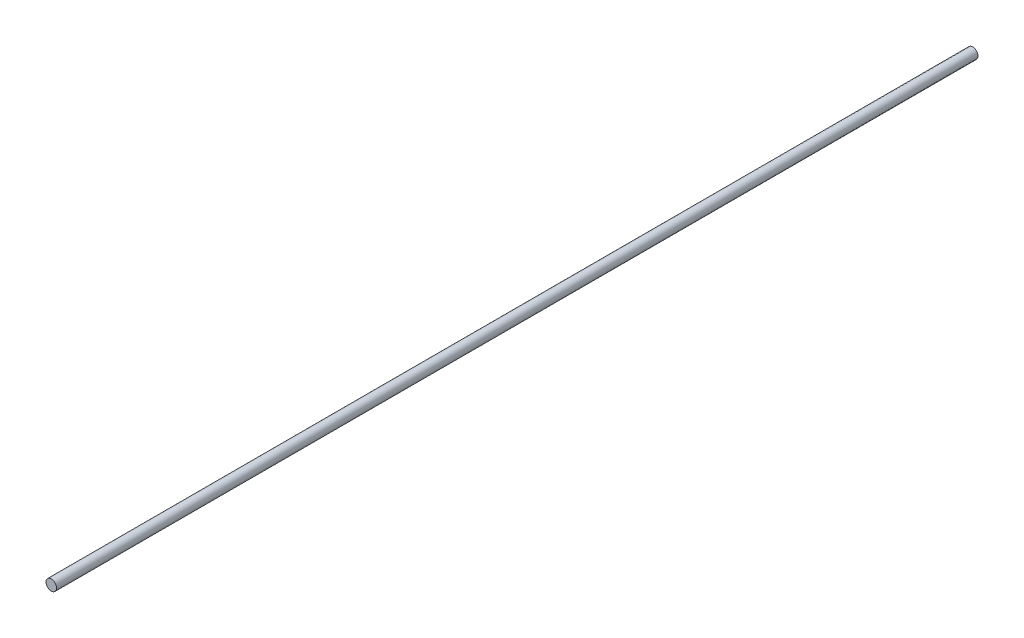
ISO-10303-21;
HEADER;
FILE_DESCRIPTION(('STEP AP214'),'2;1');
FILE_NAME('part.step','',(''),(''),'','','');
FILE_SCHEMA(('AUTOMOTIVE_DESIGN { 1 0 10303 214 1 1 1 1 }'));
ENDSEC;
DATA;
#1=APPLICATION_CONTEXT('core data for automotive mechanical design processes');
#2=APPLICATION_PROTOCOL_DEFINITION('international standard','automotive_design',2000,#1);
#3=PRODUCT_CONTEXT('',#1,'mechanical');
#4=PRODUCT('Part','Part','',(#3));
#5=PRODUCT_RELATED_PRODUCT_CATEGORY('part','',(#4));
#6=PRODUCT_DEFINITION_FORMATION('','',#4);
#7=PRODUCT_DEFINITION_CONTEXT('part definition',#1,'design');
#8=PRODUCT_DEFINITION('design','',#6,#7);
#9=PRODUCT_DEFINITION_SHAPE('','',#8);
#10=(LENGTH_UNIT() NAMED_UNIT(*) SI_UNIT(.MILLI.,.METRE.));
#11=(NAMED_UNIT(*) PLANE_ANGLE_UNIT() SI_UNIT($,.RADIAN.));
#12=(NAMED_UNIT(*) SI_UNIT($,.STERADIAN.) SOLID_ANGLE_UNIT());
#13=UNCERTAINTY_MEASURE_WITH_UNIT(LENGTH_MEASURE(1.E-05),#10,'distance_accuracy_value','');
#14=(GEOMETRIC_REPRESENTATION_CONTEXT(3) GLOBAL_UNCERTAINTY_ASSIGNED_CONTEXT((#13)) GLOBAL_UNIT_ASSIGNED_CONTEXT((#10,
#11,#12)) REPRESENTATION_CONTEXT('',''));
#15=CARTESIAN_POINT('',(0.,0.,0.));
#16=DIRECTION('',(0.,0.,1.));
#17=DIRECTION('',(1.,0.,0.));
#18=AXIS2_PLACEMENT_3D('',#15,#16,#17);
#19=CARTESIAN_POINT('',(0.,0.,700.));
#20=DIRECTION('',(0.,0.,-1.));
#21=DIRECTION('',(-1.,0.,0.));
#22=AXIS2_PLACEMENT_3D('',#19,#20,#21);
#23=CYLINDRICAL_SURFACE('',#22,4.);
#24=CARTESIAN_POINT('',(0.,0.,700.));
#25=DIRECTION('',(0.,0.,1.));
#26=DIRECTION('',(1.,0.,0.));
#27=AXIS2_PLACEMENT_3D('',#24,#25,#26);
#28=CIRCLE('',#27,4.);
#29=CARTESIAN_POINT('',(4.,0.,700.));
#30=VERTEX_POINT('',#29);
#31=EDGE_CURVE('E10',#30,#30,#28,.T.);
#32=ORIENTED_EDGE('',*,*,#31,.F.);
#33=EDGE_LOOP('',(#32));
#34=FACE_BOUND('',#33,.T.);
#35=CARTESIAN_POINT('',(0.,0.,0.));
#36=DIRECTION('',(0.,0.,1.));
#37=DIRECTION('',(1.,0.,0.));
#38=AXIS2_PLACEMENT_3D('',#35,#36,#37);
#39=CIRCLE('',#38,4.);
#40=CARTESIAN_POINT('',(4.,0.,0.));
#41=VERTEX_POINT('',#40);
#42=EDGE_CURVE('E36',#41,#41,#39,.T.);
#43=ORIENTED_EDGE('',*,*,#42,.T.);
#44=EDGE_LOOP('',(#43));
#45=FACE_BOUND('',#44,.T.);
#46=ADVANCED_FACE('F33',(#34,#45),#23,.T.);
#47=CARTESIAN_POINT('',(0.,0.,700.));
#48=DIRECTION('',(0.,0.,1.));
#49=DIRECTION('',(1.,0.,0.));
#50=AXIS2_PLACEMENT_3D('',#47,#48,#49);
#51=PLANE('',#50);
#52=ORIENTED_EDGE('',*,*,#31,.T.);
#53=EDGE_LOOP('',(#52));
#54=FACE_BOUND('',#53,.T.);
#55=ADVANCED_FACE('F48',(#54),#51,.T.);
#56=CARTESIAN_POINT('',(0.,0.,0.));
#57=DIRECTION('',(0.,0.,1.));
#58=DIRECTION('',(1.,0.,0.));
#59=AXIS2_PLACEMENT_3D('',#56,#57,#58);
#60=PLANE('',#59);
#61=ORIENTED_EDGE('',*,*,#42,.F.);
#62=EDGE_LOOP('',(#61));
#63=FACE_BOUND('',#62,.T.);
#64=ADVANCED_FACE('F46',(#63),#60,.F.);
#65=CLOSED_SHELL('',(#46,#55,#64));
#66=MANIFOLD_SOLID_BREP('B2',#65);
#67=ADVANCED_BREP_SHAPE_REPRESENTATION('',(#18,#66),#14);
#68=SHAPE_DEFINITION_REPRESENTATION(#9,#67);
ENDSEC;
END-ISO-10303-21;
